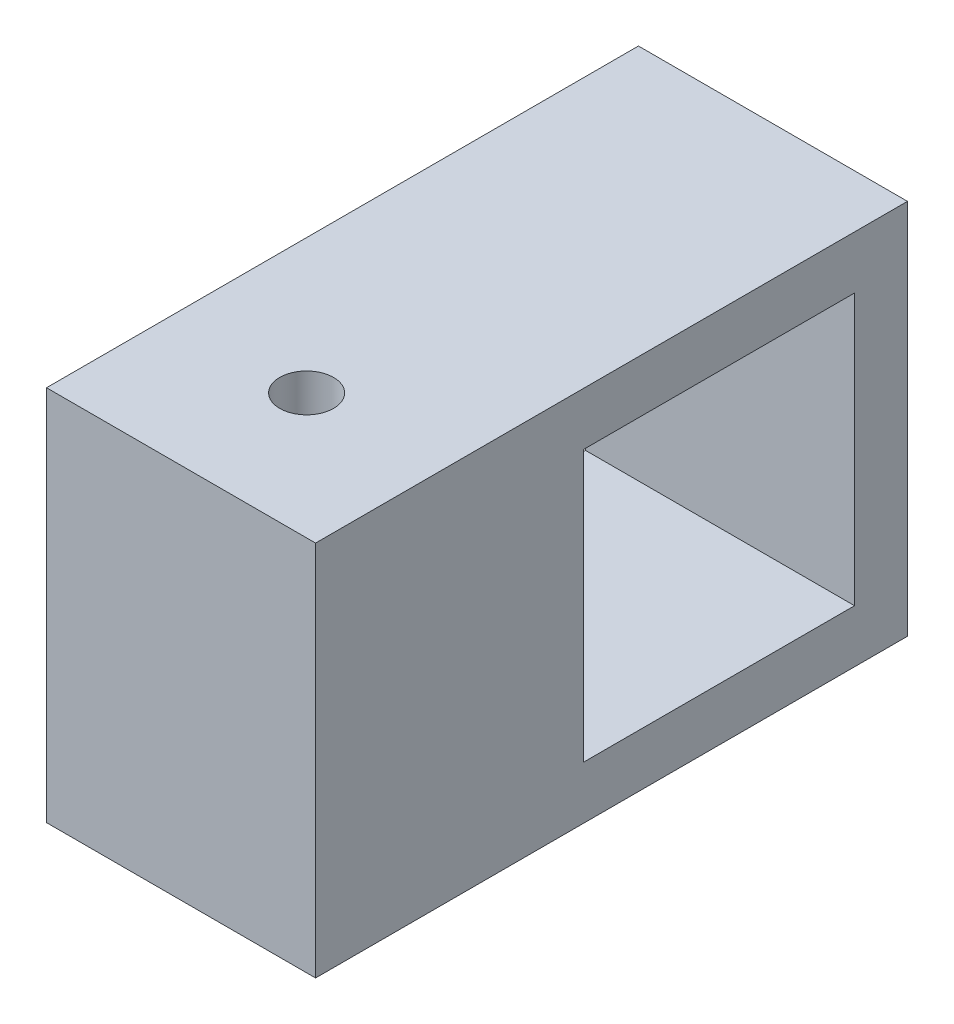
ISO-10303-21;
HEADER;
FILE_DESCRIPTION(('STEP AP214'),'2;1');
FILE_NAME('part.step','',(''),(''),'','','');
FILE_SCHEMA(('AUTOMOTIVE_DESIGN { 1 0 10303 214 1 1 1 1 }'));
ENDSEC;
DATA;
#1=APPLICATION_CONTEXT('core data for automotive mechanical design processes');
#2=APPLICATION_PROTOCOL_DEFINITION('international standard','automotive_design',2000,#1);
#3=PRODUCT_CONTEXT('',#1,'mechanical');
#4=PRODUCT('Part','Part','',(#3));
#5=PRODUCT_RELATED_PRODUCT_CATEGORY('part','',(#4));
#6=PRODUCT_DEFINITION_FORMATION('','',#4);
#7=PRODUCT_DEFINITION_CONTEXT('part definition',#1,'design');
#8=PRODUCT_DEFINITION('design','',#6,#7);
#9=PRODUCT_DEFINITION_SHAPE('','',#8);
#10=(LENGTH_UNIT() NAMED_UNIT(*) SI_UNIT(.MILLI.,.METRE.));
#11=(NAMED_UNIT(*) PLANE_ANGLE_UNIT() SI_UNIT($,.RADIAN.));
#12=(NAMED_UNIT(*) SI_UNIT($,.STERADIAN.) SOLID_ANGLE_UNIT());
#13=UNCERTAINTY_MEASURE_WITH_UNIT(LENGTH_MEASURE(1.E-05),#10,'distance_accuracy_value','');
#14=(GEOMETRIC_REPRESENTATION_CONTEXT(3) GLOBAL_UNCERTAINTY_ASSIGNED_CONTEXT((#13)) GLOBAL_UNIT_ASSIGNED_CONTEXT((#10,
#11,#12)) REPRESENTATION_CONTEXT('',''));
#15=CARTESIAN_POINT('',(0.,0.,0.));
#16=DIRECTION('',(0.,0.,1.));
#17=DIRECTION('',(1.,0.,0.));
#18=AXIS2_PLACEMENT_3D('',#15,#16,#17);
#19=CARTESIAN_POINT('',(15.,0.,-7.55));
#20=DIRECTION('',(0.,0.,1.));
#21=DIRECTION('',(1.,0.,0.));
#22=AXIS2_PLACEMENT_3D('',#19,#20,#21);
#23=PLANE('',#22);
#24=DIRECTION('',(0.,1.,0.));
#25=VECTOR('',#24,1.);
#26=CARTESIAN_POINT('',(0.,0.,-7.55));
#27=LINE('',#26,#25);
#28=CARTESIAN_POINT('',(0.,-7.55,-7.55));
#29=VERTEX_POINT('',#28);
#30=CARTESIAN_POINT('',(0.,7.55,-7.55));
#31=VERTEX_POINT('',#30);
#32=EDGE_CURVE('E166',#29,#31,#27,.T.);
#33=ORIENTED_EDGE('',*,*,#32,.F.);
#34=DIRECTION('',(-1.,0.,0.));
#35=VECTOR('',#34,1.);
#36=CARTESIAN_POINT('',(15.,-7.55,-7.55));
#37=LINE('',#36,#35);
#38=CARTESIAN_POINT('',(15.,-7.55,-7.55));
#39=VERTEX_POINT('',#38);
#40=EDGE_CURVE('E11',#39,#29,#37,.T.);
#41=ORIENTED_EDGE('',*,*,#40,.F.);
#42=DIRECTION('',(0.,1.,0.));
#43=VECTOR('',#42,1.);
#44=CARTESIAN_POINT('',(15.,0.,-7.55));
#45=LINE('',#44,#43);
#46=CARTESIAN_POINT('',(15.,7.55,-7.55));
#47=VERTEX_POINT('',#46);
#48=EDGE_CURVE('E141',#39,#47,#45,.T.);
#49=ORIENTED_EDGE('',*,*,#48,.T.);
#50=DIRECTION('',(-1.,0.,0.));
#51=VECTOR('',#50,1.);
#52=CARTESIAN_POINT('',(15.,7.55,-7.55));
#53=LINE('',#52,#51);
#54=EDGE_CURVE('E100',#47,#31,#53,.T.);
#55=ORIENTED_EDGE('',*,*,#54,.T.);
#56=EDGE_LOOP('',(#33,#41,#49,#55));
#57=FACE_BOUND('',#56,.T.);
#58=ADVANCED_FACE('F45',(#57),#23,.T.);
#59=CARTESIAN_POINT('',(15.,-7.55,0.));
#60=DIRECTION('',(0.,1.,0.));
#61=DIRECTION('',(0.,0.,1.));
#62=AXIS2_PLACEMENT_3D('',#59,#60,#61);
#63=PLANE('',#62);
#64=DIRECTION('',(0.,0.,-1.));
#65=VECTOR('',#64,1.);
#66=CARTESIAN_POINT('',(0.,-7.55,0.));
#67=LINE('',#66,#65);
#68=CARTESIAN_POINT('',(0.,-7.55,7.55));
#69=VERTEX_POINT('',#68);
#70=EDGE_CURVE('E129',#69,#29,#67,.T.);
#71=ORIENTED_EDGE('',*,*,#70,.F.);
#72=DIRECTION('',(-1.,0.,0.));
#73=VECTOR('',#72,1.);
#74=CARTESIAN_POINT('',(15.,-7.55,7.55));
#75=LINE('',#74,#73);
#76=CARTESIAN_POINT('',(15.,-7.55,7.55));
#77=VERTEX_POINT('',#76);
#78=EDGE_CURVE('E56',#77,#69,#75,.T.);
#79=ORIENTED_EDGE('',*,*,#78,.F.);
#80=DIRECTION('',(0.,0.,-1.));
#81=VECTOR('',#80,1.);
#82=CARTESIAN_POINT('',(15.,-7.55,0.));
#83=LINE('',#82,#81);
#84=EDGE_CURVE('E127',#77,#39,#83,.T.);
#85=ORIENTED_EDGE('',*,*,#84,.T.);
#86=ORIENTED_EDGE('',*,*,#40,.T.);
#87=EDGE_LOOP('',(#71,#79,#85,#86));
#88=FACE_BOUND('',#87,.T.);
#89=ADVANCED_FACE('F125',(#88),#63,.T.);
#90=CARTESIAN_POINT('',(15.,0.,7.55));
#91=DIRECTION('',(0.,0.,1.));
#92=DIRECTION('',(1.,0.,0.));
#93=AXIS2_PLACEMENT_3D('',#90,#91,#92);
#94=PLANE('',#93);
#95=DIRECTION('',(0.,1.,0.));
#96=VECTOR('',#95,1.);
#97=CARTESIAN_POINT('',(0.,0.,7.55));
#98=LINE('',#97,#96);
#99=CARTESIAN_POINT('',(0.,7.55,7.55));
#100=VERTEX_POINT('',#99);
#101=EDGE_CURVE('E171',#69,#100,#98,.T.);
#102=ORIENTED_EDGE('',*,*,#101,.T.);
#103=DIRECTION('',(-1.,0.,0.));
#104=VECTOR('',#103,1.);
#105=CARTESIAN_POINT('',(15.,7.55,7.55));
#106=LINE('',#105,#104);
#107=CARTESIAN_POINT('',(15.,7.55,7.55));
#108=VERTEX_POINT('',#107);
#109=EDGE_CURVE('E133',#108,#100,#106,.T.);
#110=ORIENTED_EDGE('',*,*,#109,.F.);
#111=DIRECTION('',(0.,1.,0.));
#112=VECTOR('',#111,1.);
#113=CARTESIAN_POINT('',(15.,0.,7.55));
#114=LINE('',#113,#112);
#115=EDGE_CURVE('E136',#77,#108,#114,.T.);
#116=ORIENTED_EDGE('',*,*,#115,.F.);
#117=ORIENTED_EDGE('',*,*,#78,.T.);
#118=EDGE_LOOP('',(#102,#110,#116,#117));
#119=FACE_BOUND('',#118,.T.);
#120=ADVANCED_FACE('F137',(#119),#94,.F.);
#121=CARTESIAN_POINT('',(15.,0.,22.5));
#122=DIRECTION('',(0.,0.,-1.));
#123=DIRECTION('',(0.,1.,0.));
#124=AXIS2_PLACEMENT_3D('',#121,#122,#123);
#125=PLANE('',#124);
#126=DIRECTION('',(0.,-1.,0.));
#127=VECTOR('',#126,1.);
#128=CARTESIAN_POINT('',(0.,0.,22.5));
#129=LINE('',#128,#127);
#130=CARTESIAN_POINT('',(0.,10.5,22.5));
#131=VERTEX_POINT('',#130);
#132=CARTESIAN_POINT('',(0.,-10.5,22.5));
#133=VERTEX_POINT('',#132);
#134=EDGE_CURVE('E152',#131,#133,#129,.T.);
#135=ORIENTED_EDGE('',*,*,#134,.T.);
#136=DIRECTION('',(-1.,0.,0.));
#137=VECTOR('',#136,1.);
#138=CARTESIAN_POINT('',(15.,-10.5,22.5));
#139=LINE('',#138,#137);
#140=CARTESIAN_POINT('',(15.,-10.5,22.5));
#141=VERTEX_POINT('',#140);
#142=EDGE_CURVE('E49',#141,#133,#139,.T.);
#143=ORIENTED_EDGE('',*,*,#142,.F.);
#144=DIRECTION('',(0.,-1.,0.));
#145=VECTOR('',#144,1.);
#146=CARTESIAN_POINT('',(15.,0.,22.5));
#147=LINE('',#146,#145);
#148=CARTESIAN_POINT('',(15.,10.5,22.5));
#149=VERTEX_POINT('',#148);
#150=EDGE_CURVE('E176',#149,#141,#147,.T.);
#151=ORIENTED_EDGE('',*,*,#150,.F.);
#152=DIRECTION('',(-1.,0.,0.));
#153=VECTOR('',#152,1.);
#154=CARTESIAN_POINT('',(15.,10.5,22.5));
#155=LINE('',#154,#153);
#156=EDGE_CURVE('E151',#149,#131,#155,.T.);
#157=ORIENTED_EDGE('',*,*,#156,.T.);
#158=EDGE_LOOP('',(#135,#143,#151,#157));
#159=FACE_BOUND('',#158,.T.);
#160=ADVANCED_FACE('F47',(#159),#125,.F.);
#161=CARTESIAN_POINT('',(15.,-10.5,0.));
#162=DIRECTION('',(0.,1.,0.));
#163=DIRECTION('',(0.,0.,1.));
#164=AXIS2_PLACEMENT_3D('',#161,#162,#163);
#165=PLANE('',#164);
#166=CARTESIAN_POINT('',(7.5,-10.5,19.5));
#167=DIRECTION('',(0.,-1.,0.));
#168=DIRECTION('',(0.,0.,-1.));
#169=AXIS2_PLACEMENT_3D('',#166,#167,#168);
#170=CIRCLE('',#169,1.5);
#171=CARTESIAN_POINT('',(7.5,-10.5,18.));
#172=VERTEX_POINT('',#171);
#173=EDGE_CURVE('E226',#172,#172,#170,.T.);
#174=ORIENTED_EDGE('',*,*,#173,.F.);
#175=EDGE_LOOP('',(#174));
#176=FACE_BOUND('',#175,.T.);
#177=DIRECTION('',(0.,0.,-1.));
#178=VECTOR('',#177,1.);
#179=CARTESIAN_POINT('',(0.,-10.5,0.));
#180=LINE('',#179,#178);
#181=CARTESIAN_POINT('',(0.,-10.5,-10.5));
#182=VERTEX_POINT('',#181);
#183=EDGE_CURVE('E156',#133,#182,#180,.T.);
#184=ORIENTED_EDGE('',*,*,#183,.T.);
#185=DIRECTION('',(-1.,0.,0.));
#186=VECTOR('',#185,1.);
#187=CARTESIAN_POINT('',(15.,-10.5,-10.5));
#188=LINE('',#187,#186);
#189=CARTESIAN_POINT('',(15.,-10.5,-10.5));
#190=VERTEX_POINT('',#189);
#191=EDGE_CURVE('E187',#190,#182,#188,.T.);
#192=ORIENTED_EDGE('',*,*,#191,.F.);
#193=DIRECTION('',(0.,0.,-1.));
#194=VECTOR('',#193,1.);
#195=CARTESIAN_POINT('',(15.,-10.5,0.));
#196=LINE('',#195,#194);
#197=EDGE_CURVE('E108',#141,#190,#196,.T.);
#198=ORIENTED_EDGE('',*,*,#197,.F.);
#199=ORIENTED_EDGE('',*,*,#142,.T.);
#200=EDGE_LOOP('',(#184,#192,#198,#199));
#201=FACE_BOUND('',#200,.T.);
#202=ADVANCED_FACE('F195',(#176,#201),#165,.F.);
#203=CARTESIAN_POINT('',(15.,0.,-10.5));
#204=DIRECTION('',(0.,0.,1.));
#205=DIRECTION('',(1.,0.,0.));
#206=AXIS2_PLACEMENT_3D('',#203,#204,#205);
#207=PLANE('',#206);
#208=DIRECTION('',(0.,1.,0.));
#209=VECTOR('',#208,1.);
#210=CARTESIAN_POINT('',(0.,0.,-10.5));
#211=LINE('',#210,#209);
#212=CARTESIAN_POINT('',(0.,10.5,-10.5));
#213=VERTEX_POINT('',#212);
#214=EDGE_CURVE('E160',#182,#213,#211,.T.);
#215=ORIENTED_EDGE('',*,*,#214,.T.);
#216=DIRECTION('',(-1.,0.,0.));
#217=VECTOR('',#216,1.);
#218=CARTESIAN_POINT('',(15.,10.5,-10.5));
#219=LINE('',#218,#217);
#220=CARTESIAN_POINT('',(15.,10.5,-10.5));
#221=VERTEX_POINT('',#220);
#222=EDGE_CURVE('E184',#221,#213,#219,.T.);
#223=ORIENTED_EDGE('',*,*,#222,.F.);
#224=DIRECTION('',(0.,1.,0.));
#225=VECTOR('',#224,1.);
#226=CARTESIAN_POINT('',(15.,0.,-10.5));
#227=LINE('',#226,#225);
#228=EDGE_CURVE('E210',#190,#221,#227,.T.);
#229=ORIENTED_EDGE('',*,*,#228,.F.);
#230=ORIENTED_EDGE('',*,*,#191,.T.);
#231=EDGE_LOOP('',(#215,#223,#229,#230));
#232=FACE_BOUND('',#231,.T.);
#233=ADVANCED_FACE('F204',(#232),#207,.F.);
#234=CARTESIAN_POINT('',(15.,10.5,0.));
#235=DIRECTION('',(0.,-1.,0.));
#236=DIRECTION('',(0.,0.,-1.));
#237=AXIS2_PLACEMENT_3D('',#234,#235,#236);
#238=PLANE('',#237);
#239=CARTESIAN_POINT('',(7.5,10.5,15.5));
#240=DIRECTION('',(0.,1.,0.));
#241=DIRECTION('',(0.,0.,1.));
#242=AXIS2_PLACEMENT_3D('',#239,#240,#241);
#243=CIRCLE('',#242,1.5);
#244=CARTESIAN_POINT('',(7.5,10.5,17.));
#245=VERTEX_POINT('',#244);
#246=EDGE_CURVE('E218',#245,#245,#243,.T.);
#247=ORIENTED_EDGE('',*,*,#246,.F.);
#248=EDGE_LOOP('',(#247));
#249=FACE_BOUND('',#248,.T.);
#250=DIRECTION('',(0.,0.,1.));
#251=VECTOR('',#250,1.);
#252=CARTESIAN_POINT('',(0.,10.5,0.));
#253=LINE('',#252,#251);
#254=EDGE_CURVE('E163',#213,#131,#253,.T.);
#255=ORIENTED_EDGE('',*,*,#254,.T.);
#256=ORIENTED_EDGE('',*,*,#156,.F.);
#257=DIRECTION('',(0.,0.,1.));
#258=VECTOR('',#257,1.);
#259=CARTESIAN_POINT('',(15.,10.5,0.));
#260=LINE('',#259,#258);
#261=EDGE_CURVE('E145',#221,#149,#260,.T.);
#262=ORIENTED_EDGE('',*,*,#261,.F.);
#263=ORIENTED_EDGE('',*,*,#222,.T.);
#264=EDGE_LOOP('',(#255,#256,#262,#263));
#265=FACE_BOUND('',#264,.T.);
#266=ADVANCED_FACE('F207',(#249,#265),#238,.F.);
#267=CARTESIAN_POINT('',(15.,7.55,0.));
#268=DIRECTION('',(0.,1.,0.));
#269=DIRECTION('',(0.,0.,1.));
#270=AXIS2_PLACEMENT_3D('',#267,#268,#269);
#271=PLANE('',#270);
#272=DIRECTION('',(0.,0.,-1.));
#273=VECTOR('',#272,1.);
#274=CARTESIAN_POINT('',(0.,7.55,0.));
#275=LINE('',#274,#273);
#276=EDGE_CURVE('E93',#100,#31,#275,.T.);
#277=ORIENTED_EDGE('',*,*,#276,.T.);
#278=ORIENTED_EDGE('',*,*,#54,.F.);
#279=DIRECTION('',(0.,0.,-1.));
#280=VECTOR('',#279,1.);
#281=CARTESIAN_POINT('',(15.,7.55,0.));
#282=LINE('',#281,#280);
#283=EDGE_CURVE('E65',#108,#47,#282,.T.);
#284=ORIENTED_EDGE('',*,*,#283,.F.);
#285=ORIENTED_EDGE('',*,*,#109,.T.);
#286=EDGE_LOOP('',(#277,#278,#284,#285));
#287=FACE_BOUND('',#286,.T.);
#288=ADVANCED_FACE('F258',(#287),#271,.F.);
#289=CARTESIAN_POINT('',(15.,0.,0.));
#290=DIRECTION('',(1.,0.,0.));
#291=DIRECTION('',(0.,0.,-1.));
#292=AXIS2_PLACEMENT_3D('',#289,#290,#291);
#293=PLANE('',#292);
#294=ORIENTED_EDGE('',*,*,#150,.T.);
#295=ORIENTED_EDGE('',*,*,#197,.T.);
#296=ORIENTED_EDGE('',*,*,#228,.T.);
#297=ORIENTED_EDGE('',*,*,#261,.T.);
#298=EDGE_LOOP('',(#294,#295,#296,#297));
#299=FACE_BOUND('',#298,.T.);
#300=ORIENTED_EDGE('',*,*,#48,.F.);
#301=ORIENTED_EDGE('',*,*,#84,.F.);
#302=ORIENTED_EDGE('',*,*,#115,.T.);
#303=ORIENTED_EDGE('',*,*,#283,.T.);
#304=EDGE_LOOP('',(#300,#301,#302,#303));
#305=FACE_BOUND('',#304,.T.);
#306=ADVANCED_FACE('F140',(#299,#305),#293,.T.);
#307=CARTESIAN_POINT('',(0.,0.,0.));
#308=DIRECTION('',(1.,0.,0.));
#309=DIRECTION('',(0.,0.,-1.));
#310=AXIS2_PLACEMENT_3D('',#307,#308,#309);
#311=PLANE('',#310);
#312=ORIENTED_EDGE('',*,*,#134,.F.);
#313=ORIENTED_EDGE('',*,*,#254,.F.);
#314=ORIENTED_EDGE('',*,*,#214,.F.);
#315=ORIENTED_EDGE('',*,*,#183,.F.);
#316=EDGE_LOOP('',(#312,#313,#314,#315));
#317=FACE_BOUND('',#316,.T.);
#318=ORIENTED_EDGE('',*,*,#32,.T.);
#319=ORIENTED_EDGE('',*,*,#276,.F.);
#320=ORIENTED_EDGE('',*,*,#101,.F.);
#321=ORIENTED_EDGE('',*,*,#70,.T.);
#322=EDGE_LOOP('',(#318,#319,#320,#321));
#323=FACE_BOUND('',#322,.T.);
#324=ADVANCED_FACE('F202',(#317,#323),#311,.F.);
#325=CARTESIAN_POINT('',(7.5,-4.5,15.5));
#326=DIRECTION('',(0.,1.,0.));
#327=DIRECTION('',(0.,0.,1.));
#328=AXIS2_PLACEMENT_3D('',#325,#326,#327);
#329=CYLINDRICAL_SURFACE('',#328,1.5);
#330=CARTESIAN_POINT('',(7.5,-4.5,15.5));
#331=DIRECTION('',(0.,1.,0.));
#332=DIRECTION('',(0.,0.,1.));
#333=AXIS2_PLACEMENT_3D('',#330,#331,#332);
#334=CIRCLE('',#333,1.5);
#335=CARTESIAN_POINT('',(7.5,-4.5,17.));
#336=VERTEX_POINT('',#335);
#337=EDGE_CURVE('E157',#336,#336,#334,.T.);
#338=ORIENTED_EDGE('',*,*,#337,.F.);
#339=EDGE_LOOP('',(#338));
#340=FACE_BOUND('',#339,.T.);
#341=ORIENTED_EDGE('',*,*,#246,.T.);
#342=EDGE_LOOP('',(#341));
#343=FACE_BOUND('',#342,.T.);
#344=ADVANCED_FACE('F267',(#340,#343),#329,.F.);
#345=CARTESIAN_POINT('',(7.5,-4.5,15.5));
#346=DIRECTION('',(0.,1.,0.));
#347=DIRECTION('',(0.,0.,1.));
#348=AXIS2_PLACEMENT_3D('',#345,#346,#347);
#349=PLANE('',#348);
#350=ORIENTED_EDGE('',*,*,#337,.T.);
#351=EDGE_LOOP('',(#350));
#352=FACE_BOUND('',#351,.T.);
#353=ADVANCED_FACE('F239',(#352),#349,.T.);
#354=CARTESIAN_POINT('',(7.5,4.5,19.5));
#355=DIRECTION('',(0.,-1.,0.));
#356=DIRECTION('',(0.,0.,-1.));
#357=AXIS2_PLACEMENT_3D('',#354,#355,#356);
#358=CYLINDRICAL_SURFACE('',#357,1.5);
#359=CARTESIAN_POINT('',(7.5,4.5,19.5));
#360=DIRECTION('',(0.,-1.,0.));
#361=DIRECTION('',(0.,0.,-1.));
#362=AXIS2_PLACEMENT_3D('',#359,#360,#361);
#363=CIRCLE('',#362,1.5);
#364=CARTESIAN_POINT('',(7.5,4.5,18.));
#365=VERTEX_POINT('',#364);
#366=EDGE_CURVE('E222',#365,#365,#363,.T.);
#367=ORIENTED_EDGE('',*,*,#366,.F.);
#368=EDGE_LOOP('',(#367));
#369=FACE_BOUND('',#368,.T.);
#370=ORIENTED_EDGE('',*,*,#173,.T.);
#371=EDGE_LOOP('',(#370));
#372=FACE_BOUND('',#371,.T.);
#373=ADVANCED_FACE('F236',(#369,#372),#358,.F.);
#374=CARTESIAN_POINT('',(7.5,4.5,19.5));
#375=DIRECTION('',(0.,-1.,0.));
#376=DIRECTION('',(0.,0.,-1.));
#377=AXIS2_PLACEMENT_3D('',#374,#375,#376);
#378=PLANE('',#377);
#379=ORIENTED_EDGE('',*,*,#366,.T.);
#380=EDGE_LOOP('',(#379));
#381=FACE_BOUND('',#380,.T.);
#382=ADVANCED_FACE('F234',(#381),#378,.T.);
#383=CLOSED_SHELL('',(#58,#89,#120,#160,#202,#233,#266,#288,#306,#324,#344,#353,#373,#382));
#384=MANIFOLD_SOLID_BREP('B2',#383);
#385=ADVANCED_BREP_SHAPE_REPRESENTATION('',(#18,#384),#14);
#386=SHAPE_DEFINITION_REPRESENTATION(#9,#385);
ENDSEC;
END-ISO-10303-21;
